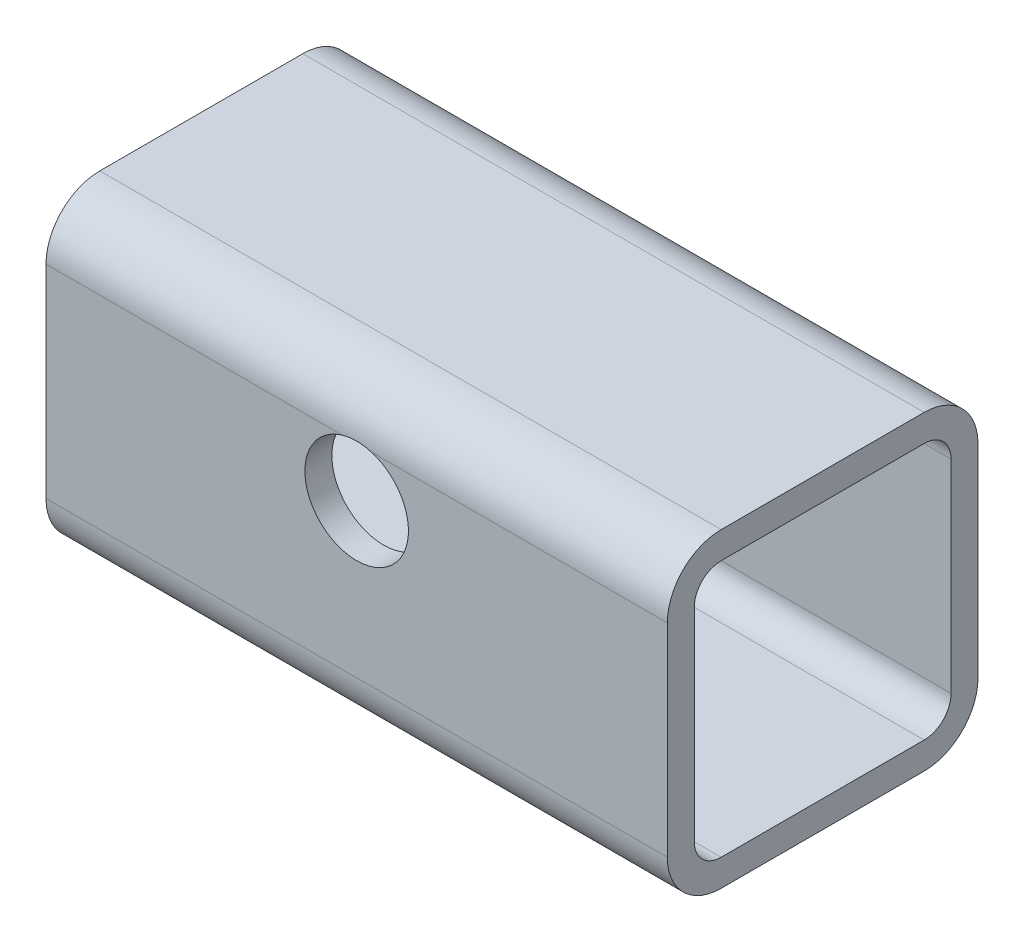
ISO-10303-21;
HEADER;
FILE_DESCRIPTION(('STEP AP214'),'2;1');
FILE_NAME('part.step','',(''),(''),'','','');
FILE_SCHEMA(('AUTOMOTIVE_DESIGN { 1 0 10303 214 1 1 1 1 }'));
ENDSEC;
DATA;
#1=APPLICATION_CONTEXT('core data for automotive mechanical design processes');
#2=APPLICATION_PROTOCOL_DEFINITION('international standard','automotive_design',2000,#1);
#3=PRODUCT_CONTEXT('',#1,'mechanical');
#4=PRODUCT('Part','Part','',(#3));
#5=PRODUCT_RELATED_PRODUCT_CATEGORY('part','',(#4));
#6=PRODUCT_DEFINITION_FORMATION('','',#4);
#7=PRODUCT_DEFINITION_CONTEXT('part definition',#1,'design');
#8=PRODUCT_DEFINITION('design','',#6,#7);
#9=PRODUCT_DEFINITION_SHAPE('','',#8);
#10=(LENGTH_UNIT() NAMED_UNIT(*) SI_UNIT(.MILLI.,.METRE.));
#11=(NAMED_UNIT(*) PLANE_ANGLE_UNIT() SI_UNIT($,.RADIAN.));
#12=(NAMED_UNIT(*) SI_UNIT($,.STERADIAN.) SOLID_ANGLE_UNIT());
#13=UNCERTAINTY_MEASURE_WITH_UNIT(LENGTH_MEASURE(1.E-05),#10,'distance_accuracy_value','');
#14=(GEOMETRIC_REPRESENTATION_CONTEXT(3) GLOBAL_UNCERTAINTY_ASSIGNED_CONTEXT((#13)) GLOBAL_UNIT_ASSIGNED_CONTEXT((#10,
#11,#12)) REPRESENTATION_CONTEXT('',''));
#15=CARTESIAN_POINT('',(0.,0.,0.));
#16=DIRECTION('',(0.,0.,1.));
#17=DIRECTION('',(1.,0.,0.));
#18=AXIS2_PLACEMENT_3D('',#15,#16,#17);
#19=CARTESIAN_POINT('',(60.,9.8,-9.8));
#20=DIRECTION('',(-1.,0.,0.));
#21=DIRECTION('',(0.,0.,1.));
#22=AXIS2_PLACEMENT_3D('',#19,#20,#21);
#23=CYLINDRICAL_SURFACE('',#22,5.2);
#24=DIRECTION('',(-1.,0.,0.));
#25=VECTOR('',#24,1.);
#26=CARTESIAN_POINT('',(60.,9.8,-15.));
#27=LINE('',#26,#25);
#28=CARTESIAN_POINT('',(60.,9.8,-15.));
#29=VERTEX_POINT('',#28);
#30=CARTESIAN_POINT('',(31.4,9.8,-15.));
#31=VERTEX_POINT('',#30);
#32=EDGE_CURVE('E221',#29,#31,#27,.T.);
#33=ORIENTED_EDGE('',*,*,#32,.T.);
#34=CARTESIAN_POINT('',(31.4,9.8,-15.));
#35=CARTESIAN_POINT('',(31.343155784959,9.81658156900364,-14.9999989720538));
#36=CARTESIAN_POINT('',(31.286021326728,9.83217072184021,-14.9999206417086));
#37=CARTESIAN_POINT('',(31.1714574071763,9.86126958309429,-14.9996595849438));
#38=CARTESIAN_POINT('',(31.1140298994615,9.87478698863816,-14.9994772574498));
#39=CARTESIAN_POINT('',(30.9988797943995,9.8997424563217,-14.999058191233));
#40=CARTESIAN_POINT('',(30.9411583397528,9.91118579016137,-14.9988215940214));
#41=CARTESIAN_POINT('',(30.8254214126575,9.93199648240796,-14.9983348625246));
#42=CARTESIAN_POINT('',(30.767406431461,9.94136657295405,-14.9980847466022));
#43=CARTESIAN_POINT('',(30.6510830015136,9.95803381823512,-14.9976047161396));
#44=CARTESIAN_POINT('',(30.5927745710078,9.96533110026478,-14.9973748003595));
#45=CARTESIAN_POINT('',(30.4758647152712,9.97785607418654,-14.9969612805748));
#46=CARTESIAN_POINT('',(30.417263021649,9.98308126165222,-14.9967777327092));
#47=CARTESIAN_POINT('',(30.2997668530483,9.99146529931364,-14.9964756017275));
#48=CARTESIAN_POINT('',(30.2408720124452,9.99461902658301,-14.9963571797911));
#49=CARTESIAN_POINT('',(30.1227897461331,9.99886309022252,-14.9961964921282));
#50=CARTESIAN_POINT('',(30.0636020449673,9.99994573669491,-14.9961545102505));
#51=CARTESIAN_POINT('',(29.944852214256,10.0000506969647,-14.9961504724372));
#52=CARTESIAN_POINT('',(29.8852900727852,9.99905999991858,-14.9961889212272));
#53=CARTESIAN_POINT('',(29.7664607754381,9.99497347815472,-14.9963438604463));
#54=CARTESIAN_POINT('',(29.7071933492617,9.9918855378676,-14.9964600585584));
#55=CARTESIAN_POINT('',(29.5889538289225,9.98360661333948,-14.996759156126));
#56=CARTESIAN_POINT('',(29.5299813668472,9.9784208831061,-14.9969418888292));
#57=CARTESIAN_POINT('',(29.4123318114976,9.96594846677554,-14.9973550932175));
#58=CARTESIAN_POINT('',(29.3536544457772,9.95866434976154,-14.9975855064303));
#59=CARTESIAN_POINT('',(29.2365949809501,9.94199711915557,-14.9980675601698));
#60=CARTESIAN_POINT('',(29.1782129003298,9.93261387577145,-14.9983192020086));
#61=CARTESIAN_POINT('',(29.0617436033638,9.91175062117661,-14.9988095358786));
#62=CARTESIAN_POINT('',(29.0036568887756,9.90026780884889,-14.9990482100506));
#63=CARTESIAN_POINT('',(28.8877780887966,9.87520716701831,-14.9994713258104));
#64=CARTESIAN_POINT('',(28.8299871725611,9.86162393250286,-14.9996556238099));
#65=CARTESIAN_POINT('',(28.7146982157603,9.83236730610074,-14.9999196380707));
#66=CARTESIAN_POINT('',(28.6572021761365,9.81668602342062,-14.9999989465565));
#67=CARTESIAN_POINT('',(28.6,9.8,-15.));
#68=B_SPLINE_CURVE_WITH_KNOTS('',3,(#34,#35,#36,#37,#38,#39,#40,#41,#42,#43,#44,#45,#46,#47,#48,
#49,#50,#51,#52,#53,#54,#55,#56,#57,#58,#59,#60,#61,#62,#63,#64,#65,#66,#67),.UNSPECIFIED.,.F.,
.F.,(4,2,2,2,2,2,2,2,2,2,2,2,2,2,2,2,4),(0.,0.17763186849784,0.354586892821934,
0.531085639875974,0.707350391326897,0.883604315721001,1.06007062393831,1.2369717238554,
1.41452839012144,1.5932026169863,1.77120882251428,1.94877193689588,2.12611857561294,
2.30347618297122,2.48107215983795,2.65913299220167,2.83788339713572),.UNSPECIFIED.);
#69=CARTESIAN_POINT('',(28.6,9.8,-15.));
#70=VERTEX_POINT('',#69);
#71=EDGE_CURVE('E210',#31,#70,#68,.T.);
#72=ORIENTED_EDGE('',*,*,#71,.T.);
#73=CARTESIAN_POINT('',(0.,9.8,-15.));
#74=VERTEX_POINT('',#73);
#75=EDGE_CURVE('E72',#70,#74,#27,.T.);
#76=ORIENTED_EDGE('',*,*,#75,.T.);
#77=CARTESIAN_POINT('',(0.,9.8,-9.8));
#78=DIRECTION('',(1.,0.,0.));
#79=DIRECTION('',(0.,0.,-1.));
#80=AXIS2_PLACEMENT_3D('',#77,#78,#79);
#81=CIRCLE('',#80,5.2);
#82=CARTESIAN_POINT('',(0.,15.,-9.8));
#83=VERTEX_POINT('',#82);
#84=EDGE_CURVE('E446',#74,#83,#81,.T.);
#85=ORIENTED_EDGE('',*,*,#84,.T.);
#86=DIRECTION('',(-1.,0.,0.));
#87=VECTOR('',#86,1.);
#88=CARTESIAN_POINT('',(60.,15.,-9.8));
#89=LINE('',#88,#87);
#90=CARTESIAN_POINT('',(60.,15.,-9.8));
#91=VERTEX_POINT('',#90);
#92=EDGE_CURVE('E79',#91,#83,#89,.T.);
#93=ORIENTED_EDGE('',*,*,#92,.F.);
#94=CARTESIAN_POINT('',(60.,9.8,-9.8));
#95=DIRECTION('',(1.,0.,0.));
#96=DIRECTION('',(0.,0.,-1.));
#97=AXIS2_PLACEMENT_3D('',#94,#95,#96);
#98=CIRCLE('',#97,5.2);
#99=EDGE_CURVE('E389',#29,#91,#98,.T.);
#100=ORIENTED_EDGE('',*,*,#99,.F.);
#101=EDGE_LOOP('',(#33,#72,#76,#85,#93,#100));
#102=FACE_BOUND('',#101,.T.);
#103=ADVANCED_FACE('F67',(#102),#23,.T.);
#104=CARTESIAN_POINT('',(60.,15.,-9.8));
#105=DIRECTION('',(0.,-1.,0.));
#106=DIRECTION('',(0.,0.,-1.));
#107=AXIS2_PLACEMENT_3D('',#104,#105,#106);
#108=PLANE('',#107);
#109=DIRECTION('',(0.,0.,1.));
#110=VECTOR('',#109,1.);
#111=CARTESIAN_POINT('',(0.,15.,-9.8));
#112=LINE('',#111,#110);
#113=CARTESIAN_POINT('',(0.,15.,9.8));
#114=VERTEX_POINT('',#113);
#115=EDGE_CURVE('E329',#83,#114,#112,.T.);
#116=ORIENTED_EDGE('',*,*,#115,.T.);
#117=DIRECTION('',(-1.,0.,0.));
#118=VECTOR('',#117,1.);
#119=CARTESIAN_POINT('',(60.,15.,9.8));
#120=LINE('',#119,#118);
#121=CARTESIAN_POINT('',(60.,15.,9.8));
#122=VERTEX_POINT('',#121);
#123=EDGE_CURVE('E308',#122,#114,#120,.T.);
#124=ORIENTED_EDGE('',*,*,#123,.F.);
#125=DIRECTION('',(0.,0.,1.));
#126=VECTOR('',#125,1.);
#127=CARTESIAN_POINT('',(60.,15.,-9.8));
#128=LINE('',#127,#126);
#129=EDGE_CURVE('E393',#91,#122,#128,.T.);
#130=ORIENTED_EDGE('',*,*,#129,.F.);
#131=ORIENTED_EDGE('',*,*,#92,.T.);
#132=EDGE_LOOP('',(#116,#124,#130,#131));
#133=FACE_BOUND('',#132,.T.);
#134=ADVANCED_FACE('F269',(#133),#108,.F.);
#135=CARTESIAN_POINT('',(60.,9.8,9.8));
#136=DIRECTION('',(-1.,0.,0.));
#137=DIRECTION('',(0.,0.,1.));
#138=AXIS2_PLACEMENT_3D('',#135,#136,#137);
#139=CYLINDRICAL_SURFACE('',#138,5.2);
#140=DIRECTION('',(-1.,0.,0.));
#141=VECTOR('',#140,1.);
#142=CARTESIAN_POINT('',(60.,9.8,15.));
#143=LINE('',#142,#141);
#144=CARTESIAN_POINT('',(28.6,9.8,15.));
#145=VERTEX_POINT('',#144);
#146=CARTESIAN_POINT('',(0.,9.8,15.));
#147=VERTEX_POINT('',#146);
#148=EDGE_CURVE('E256',#145,#147,#143,.T.);
#149=ORIENTED_EDGE('',*,*,#148,.F.);
#150=CARTESIAN_POINT('',(31.4,9.8,15.));
#151=CARTESIAN_POINT('',(31.3491529439053,9.81483111826522,14.9999681171442));
#152=CARTESIAN_POINT('',(31.2980659313895,9.82885426510369,14.9998816291476));
#153=CARTESIAN_POINT('',(31.1702236160274,9.86177129020494,14.9995773230793));
#154=CARTESIAN_POINT('',(31.0932091518936,9.87966586781765,14.999315820023));
#155=CARTESIAN_POINT('',(30.9675489848587,9.90573953980025,14.9988648614268));
#156=CARTESIAN_POINT('',(30.919132569777,9.91504078543099,14.9986853197788));
#157=CARTESIAN_POINT('',(30.8156265798665,9.93334248611603,14.9982838171331));
#158=CARTESIAN_POINT('',(30.7605010185025,9.94214060260012,14.9980593861503));
#159=CARTESIAN_POINT('',(30.6451607598279,9.95857344700013,14.9975924905294));
#160=CARTESIAN_POINT('',(30.5849219431464,9.96603953767956,14.9973501621667));
#161=CARTESIAN_POINT('',(30.4726214262681,9.97788691407513,14.996937353483));
#162=CARTESIAN_POINT('',(30.42058932418,9.98255301021599,14.9967615671056));
#163=CARTESIAN_POINT('',(30.2895981127596,9.99223294378039,14.9963343411834));
#164=CARTESIAN_POINT('',(30.2105570463711,9.99619077203564,14.9960905048359));
#165=CARTESIAN_POINT('',(30.0861879869144,9.99946247042069,14.995996280124));
#166=CARTESIAN_POINT('',(30.0408879409496,10.0000381300058,14.9960222824834));
#167=CARTESIAN_POINT('',(29.9170033897098,9.9999285301096,14.9963783790303));
#168=CARTESIAN_POINT('',(29.8384162838065,9.99800618914163,14.9969178478119));
#169=CARTESIAN_POINT('',(29.6814228876373,9.99045943770584,14.9977383972759));
#170=CARTESIAN_POINT('',(29.6030165966295,9.98483504245588,14.9980194790204));
#171=CARTESIAN_POINT('',(29.4465555025581,9.96989683767829,14.9985605180255));
#172=CARTESIAN_POINT('',(29.3685006983395,9.96058304028342,14.9988204753555));
#173=CARTESIAN_POINT('',(29.2129170260502,9.93828681073101,14.9992557729465));
#174=CARTESIAN_POINT('',(29.1353881566828,9.92530438762181,14.9994311134161));
#175=CARTESIAN_POINT('',(28.9810285464381,9.89569932705631,14.9997138858353));
#176=CARTESIAN_POINT('',(28.9041978044131,9.87907669558545,14.9998213178964));
#177=CARTESIAN_POINT('',(28.7514048774857,9.84222986345656,14.9999649319156));
#178=CARTESIAN_POINT('',(28.6754426918693,9.82200566575936,15.0000011139323));
#179=CARTESIAN_POINT('',(28.6,9.8,15.));
#180=B_SPLINE_CURVE_WITH_KNOTS('',3,(#150,#151,#152,#153,#154,#155,#156,#157,#158,#159,#160,
#161,#162,#163,#164,#165,#166,#167,#168,#169,#170,#171,#172,#173,#174,#175,#176,#177,#178,#179),
.UNSPECIFIED.,.F.,.F.,(4,2,2,2,2,2,2,2,2,2,2,2,2,2,4),(0.,0.158900873713682,0.396002356912597,
0.543889968775195,0.711329269925982,0.89338728842252,1.0500895569875,1.28740664797233,
1.42330547136926,1.65904608749389,1.89478573457621,2.13052460642471,2.36626289684981,
2.60200079966336,2.83773850867815),.UNSPECIFIED.);
#181=CARTESIAN_POINT('',(31.4,9.8,15.));
#182=VERTEX_POINT('',#181);
#183=EDGE_CURVE('E86',#182,#145,#180,.T.);
#184=ORIENTED_EDGE('',*,*,#183,.F.);
#185=CARTESIAN_POINT('',(60.,9.8,15.));
#186=VERTEX_POINT('',#185);
#187=EDGE_CURVE('E311',#186,#182,#143,.T.);
#188=ORIENTED_EDGE('',*,*,#187,.F.);
#189=CARTESIAN_POINT('',(60.,9.8,9.8));
#190=DIRECTION('',(1.,0.,0.));
#191=DIRECTION('',(0.,0.,-1.));
#192=AXIS2_PLACEMENT_3D('',#189,#190,#191);
#193=CIRCLE('',#192,5.2);
#194=EDGE_CURVE('E396',#122,#186,#193,.T.);
#195=ORIENTED_EDGE('',*,*,#194,.F.);
#196=ORIENTED_EDGE('',*,*,#123,.T.);
#197=CARTESIAN_POINT('',(0.,9.8,9.8));
#198=DIRECTION('',(1.,0.,0.));
#199=DIRECTION('',(0.,0.,-1.));
#200=AXIS2_PLACEMENT_3D('',#197,#198,#199);
#201=CIRCLE('',#200,5.2);
#202=EDGE_CURVE('E324',#114,#147,#201,.T.);
#203=ORIENTED_EDGE('',*,*,#202,.T.);
#204=EDGE_LOOP('',(#149,#184,#188,#195,#196,#203));
#205=FACE_BOUND('',#204,.T.);
#206=ADVANCED_FACE('F258',(#205),#139,.T.);
#207=CARTESIAN_POINT('',(60.,-9.8,15.));
#208=DIRECTION('',(0.,0.,-1.));
#209=DIRECTION('',(-1.,0.,0.));
#210=AXIS2_PLACEMENT_3D('',#207,#208,#209);
#211=PLANE('',#210);
#212=ORIENTED_EDGE('',*,*,#187,.T.);
#213=CARTESIAN_POINT('',(30.,5.,15.));
#214=DIRECTION('',(0.,0.,1.));
#215=DIRECTION('',(1.,0.,0.));
#216=AXIS2_PLACEMENT_3D('',#213,#214,#215);
#217=CIRCLE('',#216,5.);
#218=EDGE_CURVE('E322',#145,#182,#217,.T.);
#219=ORIENTED_EDGE('',*,*,#218,.F.);
#220=ORIENTED_EDGE('',*,*,#148,.T.);
#221=DIRECTION('',(0.,-1.,0.));
#222=VECTOR('',#221,1.);
#223=CARTESIAN_POINT('',(0.,-9.8,15.));
#224=LINE('',#223,#222);
#225=CARTESIAN_POINT('',(0.,-9.8,15.));
#226=VERTEX_POINT('',#225);
#227=EDGE_CURVE('E321',#147,#226,#224,.T.);
#228=ORIENTED_EDGE('',*,*,#227,.T.);
#229=DIRECTION('',(-1.,0.,0.));
#230=VECTOR('',#229,1.);
#231=CARTESIAN_POINT('',(60.,-9.8,15.));
#232=LINE('',#231,#230);
#233=CARTESIAN_POINT('',(60.,-9.8,15.));
#234=VERTEX_POINT('',#233);
#235=EDGE_CURVE('E303',#234,#226,#232,.T.);
#236=ORIENTED_EDGE('',*,*,#235,.F.);
#237=DIRECTION('',(0.,-1.,0.));
#238=VECTOR('',#237,1.);
#239=CARTESIAN_POINT('',(60.,-9.8,15.));
#240=LINE('',#239,#238);
#241=EDGE_CURVE('E399',#186,#234,#240,.T.);
#242=ORIENTED_EDGE('',*,*,#241,.F.);
#243=EDGE_LOOP('',(#212,#219,#220,#228,#236,#242));
#244=FACE_BOUND('',#243,.T.);
#245=ADVANCED_FACE('F268',(#244),#211,.F.);
#246=CARTESIAN_POINT('',(60.,-9.8,9.8));
#247=DIRECTION('',(-1.,0.,0.));
#248=DIRECTION('',(0.,0.,1.));
#249=AXIS2_PLACEMENT_3D('',#246,#247,#248);
#250=CYLINDRICAL_SURFACE('',#249,5.2);
#251=CARTESIAN_POINT('',(0.,-9.8,9.8));
#252=DIRECTION('',(1.,0.,0.));
#253=DIRECTION('',(0.,0.,-1.));
#254=AXIS2_PLACEMENT_3D('',#251,#252,#253);
#255=CIRCLE('',#254,5.2);
#256=CARTESIAN_POINT('',(0.,-15.,9.8));
#257=VERTEX_POINT('',#256);
#258=EDGE_CURVE('E334',#226,#257,#255,.T.);
#259=ORIENTED_EDGE('',*,*,#258,.T.);
#260=DIRECTION('',(-1.,0.,0.));
#261=VECTOR('',#260,1.);
#262=CARTESIAN_POINT('',(60.,-15.,9.8));
#263=LINE('',#262,#261);
#264=CARTESIAN_POINT('',(60.,-15.,9.8));
#265=VERTEX_POINT('',#264);
#266=EDGE_CURVE('E299',#265,#257,#263,.T.);
#267=ORIENTED_EDGE('',*,*,#266,.F.);
#268=CARTESIAN_POINT('',(60.,-9.8,9.8));
#269=DIRECTION('',(1.,0.,0.));
#270=DIRECTION('',(0.,0.,-1.));
#271=AXIS2_PLACEMENT_3D('',#268,#269,#270);
#272=CIRCLE('',#271,5.2);
#273=EDGE_CURVE('E402',#234,#265,#272,.T.);
#274=ORIENTED_EDGE('',*,*,#273,.F.);
#275=ORIENTED_EDGE('',*,*,#235,.T.);
#276=EDGE_LOOP('',(#259,#267,#274,#275));
#277=FACE_BOUND('',#276,.T.);
#278=ADVANCED_FACE('F552',(#277),#250,.T.);
#279=CARTESIAN_POINT('',(60.,-15.,9.8));
#280=DIRECTION('',(0.,1.,0.));
#281=DIRECTION('',(0.,0.,1.));
#282=AXIS2_PLACEMENT_3D('',#279,#280,#281);
#283=PLANE('',#282);
#284=DIRECTION('',(0.,0.,-1.));
#285=VECTOR('',#284,1.);
#286=CARTESIAN_POINT('',(0.,-15.,9.8));
#287=LINE('',#286,#285);
#288=CARTESIAN_POINT('',(0.,-15.,-9.8));
#289=VERTEX_POINT('',#288);
#290=EDGE_CURVE('E338',#257,#289,#287,.T.);
#291=ORIENTED_EDGE('',*,*,#290,.T.);
#292=DIRECTION('',(-1.,0.,0.));
#293=VECTOR('',#292,1.);
#294=CARTESIAN_POINT('',(60.,-15.,-9.8));
#295=LINE('',#294,#293);
#296=CARTESIAN_POINT('',(60.,-15.,-9.8));
#297=VERTEX_POINT('',#296);
#298=EDGE_CURVE('E295',#297,#289,#295,.T.);
#299=ORIENTED_EDGE('',*,*,#298,.F.);
#300=DIRECTION('',(0.,0.,-1.));
#301=VECTOR('',#300,1.);
#302=CARTESIAN_POINT('',(60.,-15.,9.8));
#303=LINE('',#302,#301);
#304=EDGE_CURVE('E405',#265,#297,#303,.T.);
#305=ORIENTED_EDGE('',*,*,#304,.F.);
#306=ORIENTED_EDGE('',*,*,#266,.T.);
#307=EDGE_LOOP('',(#291,#299,#305,#306));
#308=FACE_BOUND('',#307,.T.);
#309=ADVANCED_FACE('F547',(#308),#283,.F.);
#310=CARTESIAN_POINT('',(60.,-9.8,-9.8));
#311=DIRECTION('',(-1.,0.,0.));
#312=DIRECTION('',(0.,0.,1.));
#313=AXIS2_PLACEMENT_3D('',#310,#311,#312);
#314=CYLINDRICAL_SURFACE('',#313,5.2);
#315=CARTESIAN_POINT('',(0.,-9.8,-9.8));
#316=DIRECTION('',(1.,0.,0.));
#317=DIRECTION('',(0.,0.,-1.));
#318=AXIS2_PLACEMENT_3D('',#315,#316,#317);
#319=CIRCLE('',#318,5.2);
#320=CARTESIAN_POINT('',(0.,-9.8,-15.));
#321=VERTEX_POINT('',#320);
#322=EDGE_CURVE('E343',#289,#321,#319,.T.);
#323=ORIENTED_EDGE('',*,*,#322,.T.);
#324=DIRECTION('',(-1.,0.,0.));
#325=VECTOR('',#324,1.);
#326=CARTESIAN_POINT('',(60.,-9.8,-15.));
#327=LINE('',#326,#325);
#328=CARTESIAN_POINT('',(60.,-9.8,-15.));
#329=VERTEX_POINT('',#328);
#330=EDGE_CURVE('E235',#329,#321,#327,.T.);
#331=ORIENTED_EDGE('',*,*,#330,.F.);
#332=CARTESIAN_POINT('',(60.,-9.8,-9.8));
#333=DIRECTION('',(1.,0.,0.));
#334=DIRECTION('',(0.,0.,-1.));
#335=AXIS2_PLACEMENT_3D('',#332,#333,#334);
#336=CIRCLE('',#335,5.2);
#337=EDGE_CURVE('E408',#297,#329,#336,.T.);
#338=ORIENTED_EDGE('',*,*,#337,.F.);
#339=ORIENTED_EDGE('',*,*,#298,.T.);
#340=EDGE_LOOP('',(#323,#331,#338,#339));
#341=FACE_BOUND('',#340,.T.);
#342=ADVANCED_FACE('F542',(#341),#314,.T.);
#343=CARTESIAN_POINT('',(60.,9.8,9.8));
#344=DIRECTION('',(-1.,0.,0.));
#345=DIRECTION('',(0.,0.,1.));
#346=AXIS2_PLACEMENT_3D('',#343,#344,#345);
#347=CYLINDRICAL_SURFACE('',#346,2.6);
#348=CARTESIAN_POINT('',(28.6,9.8,12.4));
#349=CARTESIAN_POINT('',(28.6682218028846,9.81989801218617,12.3999963920888));
#350=CARTESIAN_POINT('',(28.7368586872689,9.83833872609492,12.3997720826648));
#351=CARTESIAN_POINT('',(28.8748536764175,9.87227825565255,12.3990512345332));
#352=CARTESIAN_POINT('',(28.94421177114,9.88777711220434,12.3985546996109));
#353=CARTESIAN_POINT('',(29.153203818833,9.92982000850826,12.3969105248649));
#354=CARTESIAN_POINT('',(29.2937589814304,9.95191137956892,12.3956082978441));
#355=CARTESIAN_POINT('',(29.5729353294105,9.98366253841054,12.393552550057));
#356=CARTESIAN_POINT('',(29.7115251990587,9.99360016520899,12.3927869438548));
#357=CARTESIAN_POINT('',(29.9889953313389,10.001914430985,12.392149721752));
#358=CARTESIAN_POINT('',(30.1278754907364,10.00029464967,12.3922778290388));
#359=CARTESIAN_POINT('',(30.4566972047728,9.98273704661954,12.3935990279105));
#360=CARTESIAN_POINT('',(30.6463990808293,9.96169312354255,12.3951708571664));
#361=CARTESIAN_POINT('',(30.9296452115551,9.9137719603034,12.397555537091));
#362=CARTESIAN_POINT('',(31.0246115505461,9.89484914502915,12.3983616050628));
#363=CARTESIAN_POINT('',(31.2133055625079,9.8515207942107,12.3995779711224));
#364=CARTESIAN_POINT('',(31.3070330082341,9.82711426719503,12.3999881975698));
#365=CARTESIAN_POINT('',(31.4,9.8,12.4));
#366=B_SPLINE_CURVE_WITH_KNOTS('',3,(#348,#349,#350,#351,#352,#353,#354,#355,#356,#357,#358,
#359,#360,#361,#362,#363,#364,#365),.UNSPECIFIED.,.F.,.F.,(4,2,2,2,2,2,2,2,4),(0.,
0.213158048087103,0.426313132255314,0.852612567278013,1.26897263338285,1.68520374474833,
2.25639796525296,2.5467700750208,2.83719472724097),.UNSPECIFIED.);
#367=CARTESIAN_POINT('',(28.6,9.8,12.4));
#368=VERTEX_POINT('',#367);
#369=CARTESIAN_POINT('',(31.4,9.8,12.4));
#370=VERTEX_POINT('',#369);
#371=EDGE_CURVE('E496',#368,#370,#366,.T.);
#372=ORIENTED_EDGE('',*,*,#371,.F.);
#373=DIRECTION('',(-1.,0.,0.));
#374=VECTOR('',#373,1.);
#375=CARTESIAN_POINT('',(60.,9.8,12.4));
#376=LINE('',#375,#374);
#377=CARTESIAN_POINT('',(0.,9.8,12.4));
#378=VERTEX_POINT('',#377);
#379=EDGE_CURVE('E414',#368,#378,#376,.T.);
#380=ORIENTED_EDGE('',*,*,#379,.T.);
#381=CARTESIAN_POINT('',(0.,9.8,9.8));
#382=DIRECTION('',(1.,0.,0.));
#383=DIRECTION('',(0.,0.,-1.));
#384=AXIS2_PLACEMENT_3D('',#381,#382,#383);
#385=CIRCLE('',#384,2.6);
#386=CARTESIAN_POINT('',(0.,12.4,9.8));
#387=VERTEX_POINT('',#386);
#388=EDGE_CURVE('E223',#387,#378,#385,.T.);
#389=ORIENTED_EDGE('',*,*,#388,.F.);
#390=DIRECTION('',(-1.,0.,0.));
#391=VECTOR('',#390,1.);
#392=CARTESIAN_POINT('',(60.,12.4,9.8));
#393=LINE('',#392,#391);
#394=CARTESIAN_POINT('',(60.,12.4,9.8));
#395=VERTEX_POINT('',#394);
#396=EDGE_CURVE('E232',#395,#387,#393,.T.);
#397=ORIENTED_EDGE('',*,*,#396,.F.);
#398=CARTESIAN_POINT('',(60.,9.8,9.8));
#399=DIRECTION('',(1.,0.,0.));
#400=DIRECTION('',(0.,0.,-1.));
#401=AXIS2_PLACEMENT_3D('',#398,#399,#400);
#402=CIRCLE('',#401,2.6);
#403=CARTESIAN_POINT('',(60.,9.8,12.4));
#404=VERTEX_POINT('',#403);
#405=EDGE_CURVE('E349',#395,#404,#402,.T.);
#406=ORIENTED_EDGE('',*,*,#405,.T.);
#407=EDGE_CURVE('E453',#404,#370,#376,.T.);
#408=ORIENTED_EDGE('',*,*,#407,.T.);
#409=EDGE_LOOP('',(#372,#380,#389,#397,#406,#408));
#410=FACE_BOUND('',#409,.T.);
#411=ADVANCED_FACE('F69',(#410),#347,.F.);
#412=CARTESIAN_POINT('',(60.,12.4,-9.8));
#413=DIRECTION('',(0.,-1.,0.));
#414=DIRECTION('',(0.,0.,-1.));
#415=AXIS2_PLACEMENT_3D('',#412,#413,#414);
#416=PLANE('',#415);
#417=DIRECTION('',(0.,0.,1.));
#418=VECTOR('',#417,1.);
#419=CARTESIAN_POINT('',(0.,12.4,-9.8));
#420=LINE('',#419,#418);
#421=CARTESIAN_POINT('',(0.,12.4,-9.8));
#422=VERTEX_POINT('',#421);
#423=EDGE_CURVE('E418',#422,#387,#420,.T.);
#424=ORIENTED_EDGE('',*,*,#423,.F.);
#425=DIRECTION('',(-1.,0.,0.));
#426=VECTOR('',#425,1.);
#427=CARTESIAN_POINT('',(60.,12.4,-9.8));
#428=LINE('',#427,#426);
#429=CARTESIAN_POINT('',(60.,12.4,-9.8));
#430=VERTEX_POINT('',#429);
#431=EDGE_CURVE('E236',#430,#422,#428,.T.);
#432=ORIENTED_EDGE('',*,*,#431,.F.);
#433=DIRECTION('',(0.,0.,1.));
#434=VECTOR('',#433,1.);
#435=CARTESIAN_POINT('',(60.,12.4,-9.8));
#436=LINE('',#435,#434);
#437=EDGE_CURVE('E352',#430,#395,#436,.T.);
#438=ORIENTED_EDGE('',*,*,#437,.T.);
#439=ORIENTED_EDGE('',*,*,#396,.T.);
#440=EDGE_LOOP('',(#424,#432,#438,#439));
#441=FACE_BOUND('',#440,.T.);
#442=ADVANCED_FACE('F541',(#441),#416,.T.);
#443=CARTESIAN_POINT('',(60.,9.8,-9.8));
#444=DIRECTION('',(-1.,0.,0.));
#445=DIRECTION('',(0.,0.,1.));
#446=AXIS2_PLACEMENT_3D('',#443,#444,#445);
#447=CYLINDRICAL_SURFACE('',#446,2.6);
#448=CARTESIAN_POINT('',(31.4,9.8,-12.4));
#449=CARTESIAN_POINT('',(31.3317781971154,9.81989801218617,-12.3999963920888));
#450=CARTESIAN_POINT('',(31.2631413127311,9.83833872609492,-12.3997720826648));
#451=CARTESIAN_POINT('',(31.1251463235825,9.87227825565255,-12.3990512345332));
#452=CARTESIAN_POINT('',(31.05578822886,9.88777711220434,-12.3985546996109));
#453=CARTESIAN_POINT('',(30.846796181167,9.92982000850826,-12.3969105248649));
#454=CARTESIAN_POINT('',(30.7062410185696,9.95191137956892,-12.3956082978441));
#455=CARTESIAN_POINT('',(30.4270646705895,9.98366253841054,-12.393552550057));
#456=CARTESIAN_POINT('',(30.2884748009413,9.99360016520899,-12.3927869438548));
#457=CARTESIAN_POINT('',(30.0110046686611,10.001914430985,-12.392149721752));
#458=CARTESIAN_POINT('',(29.8721245092636,10.00029464967,-12.3922778290388));
#459=CARTESIAN_POINT('',(29.5433027952272,9.98273704661954,-12.3935990279105));
#460=CARTESIAN_POINT('',(29.3536009191707,9.96169312354255,-12.3951708571664));
#461=CARTESIAN_POINT('',(29.0703547884449,9.9137719603034,-12.397555537091));
#462=CARTESIAN_POINT('',(28.9753884494539,9.89484914502915,-12.3983616050628));
#463=CARTESIAN_POINT('',(28.7866944374921,9.8515207942107,-12.3995779711224));
#464=CARTESIAN_POINT('',(28.6929669917659,9.82711426719503,-12.3999881975698));
#465=CARTESIAN_POINT('',(28.6,9.8,-12.4));
#466=B_SPLINE_CURVE_WITH_KNOTS('',3,(#448,#449,#450,#451,#452,#453,#454,#455,#456,#457,#458,
#459,#460,#461,#462,#463,#464,#465),.UNSPECIFIED.,.F.,.F.,(4,2,2,2,2,2,2,2,4),(0.,
0.213158048087103,0.426313132255314,0.852612567278013,1.26897263338285,1.68520374474833,
2.25639796525296,2.5467700750208,2.83719472724097),.UNSPECIFIED.);
#467=CARTESIAN_POINT('',(31.4,9.8,-12.4));
#468=VERTEX_POINT('',#467);
#469=CARTESIAN_POINT('',(28.6,9.8,-12.4));
#470=VERTEX_POINT('',#469);
#471=EDGE_CURVE('E94',#468,#470,#466,.T.);
#472=ORIENTED_EDGE('',*,*,#471,.F.);
#473=DIRECTION('',(-1.,0.,0.));
#474=VECTOR('',#473,1.);
#475=CARTESIAN_POINT('',(60.,9.8,-12.4));
#476=LINE('',#475,#474);
#477=CARTESIAN_POINT('',(60.,9.8,-12.4));
#478=VERTEX_POINT('',#477);
#479=EDGE_CURVE('E243',#478,#468,#476,.T.);
#480=ORIENTED_EDGE('',*,*,#479,.F.);
#481=CARTESIAN_POINT('',(60.,9.8,-9.8));
#482=DIRECTION('',(1.,0.,0.));
#483=DIRECTION('',(0.,0.,-1.));
#484=AXIS2_PLACEMENT_3D('',#481,#482,#483);
#485=CIRCLE('',#484,2.6);
#486=EDGE_CURVE('E359',#478,#430,#485,.T.);
#487=ORIENTED_EDGE('',*,*,#486,.T.);
#488=ORIENTED_EDGE('',*,*,#431,.T.);
#489=CARTESIAN_POINT('',(0.,9.8,-9.8));
#490=DIRECTION('',(1.,0.,0.));
#491=DIRECTION('',(0.,0.,-1.));
#492=AXIS2_PLACEMENT_3D('',#489,#490,#491);
#493=CIRCLE('',#492,2.6);
#494=CARTESIAN_POINT('',(0.,9.8,-12.4));
#495=VERTEX_POINT('',#494);
#496=EDGE_CURVE('E422',#495,#422,#493,.T.);
#497=ORIENTED_EDGE('',*,*,#496,.F.);
#498=EDGE_CURVE('E467',#470,#495,#476,.T.);
#499=ORIENTED_EDGE('',*,*,#498,.F.);
#500=EDGE_LOOP('',(#472,#480,#487,#488,#497,#499));
#501=FACE_BOUND('',#500,.T.);
#502=ADVANCED_FACE('F478',(#501),#447,.F.);
#503=CARTESIAN_POINT('',(60.,9.8,-12.4));
#504=DIRECTION('',(0.,0.,1.));
#505=DIRECTION('',(1.,0.,0.));
#506=AXIS2_PLACEMENT_3D('',#503,#504,#505);
#507=PLANE('',#506);
#508=CARTESIAN_POINT('',(30.,5.,-12.4));
#509=DIRECTION('',(0.,0.,1.));
#510=DIRECTION('',(1.,0.,0.));
#511=AXIS2_PLACEMENT_3D('',#508,#509,#510);
#512=CIRCLE('',#511,5.);
#513=EDGE_CURVE('E476',#470,#468,#512,.T.);
#514=ORIENTED_EDGE('',*,*,#513,.F.);
#515=ORIENTED_EDGE('',*,*,#498,.T.);
#516=DIRECTION('',(0.,1.,0.));
#517=VECTOR('',#516,1.);
#518=CARTESIAN_POINT('',(0.,9.8,-12.4));
#519=LINE('',#518,#517);
#520=CARTESIAN_POINT('',(0.,-9.8,-12.4));
#521=VERTEX_POINT('',#520);
#522=EDGE_CURVE('E426',#521,#495,#519,.T.);
#523=ORIENTED_EDGE('',*,*,#522,.F.);
#524=DIRECTION('',(-1.,0.,0.));
#525=VECTOR('',#524,1.);
#526=CARTESIAN_POINT('',(60.,-9.8,-12.4));
#527=LINE('',#526,#525);
#528=CARTESIAN_POINT('',(60.,-9.8,-12.4));
#529=VERTEX_POINT('',#528);
#530=EDGE_CURVE('E465',#529,#521,#527,.T.);
#531=ORIENTED_EDGE('',*,*,#530,.F.);
#532=DIRECTION('',(0.,1.,0.));
#533=VECTOR('',#532,1.);
#534=CARTESIAN_POINT('',(60.,9.8,-12.4));
#535=LINE('',#534,#533);
#536=EDGE_CURVE('E369',#529,#478,#535,.T.);
#537=ORIENTED_EDGE('',*,*,#536,.T.);
#538=ORIENTED_EDGE('',*,*,#479,.T.);
#539=EDGE_LOOP('',(#514,#515,#523,#531,#537,#538));
#540=FACE_BOUND('',#539,.T.);
#541=ADVANCED_FACE('F475',(#540),#507,.T.);
#542=CARTESIAN_POINT('',(60.,-9.8,-9.8));
#543=DIRECTION('',(-1.,0.,0.));
#544=DIRECTION('',(0.,0.,1.));
#545=AXIS2_PLACEMENT_3D('',#542,#543,#544);
#546=CYLINDRICAL_SURFACE('',#545,2.6);
#547=CARTESIAN_POINT('',(0.,-9.8,-9.8));
#548=DIRECTION('',(1.,0.,0.));
#549=DIRECTION('',(0.,0.,-1.));
#550=AXIS2_PLACEMENT_3D('',#547,#548,#549);
#551=CIRCLE('',#550,2.6);
#552=CARTESIAN_POINT('',(0.,-12.4,-9.8));
#553=VERTEX_POINT('',#552);
#554=EDGE_CURVE('E430',#553,#521,#551,.T.);
#555=ORIENTED_EDGE('',*,*,#554,.F.);
#556=DIRECTION('',(-1.,0.,0.));
#557=VECTOR('',#556,1.);
#558=CARTESIAN_POINT('',(60.,-12.4,-9.8));
#559=LINE('',#558,#557);
#560=CARTESIAN_POINT('',(60.,-12.4,-9.8));
#561=VERTEX_POINT('',#560);
#562=EDGE_CURVE('E462',#561,#553,#559,.T.);
#563=ORIENTED_EDGE('',*,*,#562,.F.);
#564=CARTESIAN_POINT('',(60.,-9.8,-9.8));
#565=DIRECTION('',(1.,0.,0.));
#566=DIRECTION('',(0.,0.,-1.));
#567=AXIS2_PLACEMENT_3D('',#564,#565,#566);
#568=CIRCLE('',#567,2.6);
#569=EDGE_CURVE('E373',#561,#529,#568,.T.);
#570=ORIENTED_EDGE('',*,*,#569,.T.);
#571=ORIENTED_EDGE('',*,*,#530,.T.);
#572=EDGE_LOOP('',(#555,#563,#570,#571));
#573=FACE_BOUND('',#572,.T.);
#574=ADVANCED_FACE('F483',(#573),#546,.F.);
#575=CARTESIAN_POINT('',(60.,-12.4,9.8));
#576=DIRECTION('',(0.,1.,0.));
#577=DIRECTION('',(0.,0.,1.));
#578=AXIS2_PLACEMENT_3D('',#575,#576,#577);
#579=PLANE('',#578);
#580=DIRECTION('',(0.,0.,-1.));
#581=VECTOR('',#580,1.);
#582=CARTESIAN_POINT('',(0.,-12.4,9.8));
#583=LINE('',#582,#581);
#584=CARTESIAN_POINT('',(0.,-12.4,9.8));
#585=VERTEX_POINT('',#584);
#586=EDGE_CURVE('E434',#585,#553,#583,.T.);
#587=ORIENTED_EDGE('',*,*,#586,.F.);
#588=DIRECTION('',(-1.,0.,0.));
#589=VECTOR('',#588,1.);
#590=CARTESIAN_POINT('',(60.,-12.4,9.8));
#591=LINE('',#590,#589);
#592=CARTESIAN_POINT('',(60.,-12.4,9.8));
#593=VERTEX_POINT('',#592);
#594=EDGE_CURVE('E459',#593,#585,#591,.T.);
#595=ORIENTED_EDGE('',*,*,#594,.F.);
#596=DIRECTION('',(0.,0.,-1.));
#597=VECTOR('',#596,1.);
#598=CARTESIAN_POINT('',(60.,-12.4,9.8));
#599=LINE('',#598,#597);
#600=EDGE_CURVE('E377',#593,#561,#599,.T.);
#601=ORIENTED_EDGE('',*,*,#600,.T.);
#602=ORIENTED_EDGE('',*,*,#562,.T.);
#603=EDGE_LOOP('',(#587,#595,#601,#602));
#604=FACE_BOUND('',#603,.T.);
#605=ADVANCED_FACE('F579',(#604),#579,.T.);
#606=CARTESIAN_POINT('',(60.,-9.8,9.8));
#607=DIRECTION('',(-1.,0.,0.));
#608=DIRECTION('',(0.,0.,1.));
#609=AXIS2_PLACEMENT_3D('',#606,#607,#608);
#610=CYLINDRICAL_SURFACE('',#609,2.6);
#611=CARTESIAN_POINT('',(0.,-9.8,9.8));
#612=DIRECTION('',(1.,0.,0.));
#613=DIRECTION('',(0.,0.,-1.));
#614=AXIS2_PLACEMENT_3D('',#611,#612,#613);
#615=CIRCLE('',#614,2.6);
#616=CARTESIAN_POINT('',(0.,-9.8,12.4));
#617=VERTEX_POINT('',#616);
#618=EDGE_CURVE('E438',#617,#585,#615,.T.);
#619=ORIENTED_EDGE('',*,*,#618,.F.);
#620=DIRECTION('',(-1.,0.,0.));
#621=VECTOR('',#620,1.);
#622=CARTESIAN_POINT('',(60.,-9.8,12.4));
#623=LINE('',#622,#621);
#624=CARTESIAN_POINT('',(60.,-9.8,12.4));
#625=VERTEX_POINT('',#624);
#626=EDGE_CURVE('E456',#625,#617,#623,.T.);
#627=ORIENTED_EDGE('',*,*,#626,.F.);
#628=CARTESIAN_POINT('',(60.,-9.8,9.8));
#629=DIRECTION('',(1.,0.,0.));
#630=DIRECTION('',(0.,0.,-1.));
#631=AXIS2_PLACEMENT_3D('',#628,#629,#630);
#632=CIRCLE('',#631,2.6);
#633=EDGE_CURVE('E381',#625,#593,#632,.T.);
#634=ORIENTED_EDGE('',*,*,#633,.T.);
#635=ORIENTED_EDGE('',*,*,#594,.T.);
#636=EDGE_LOOP('',(#619,#627,#634,#635));
#637=FACE_BOUND('',#636,.T.);
#638=ADVANCED_FACE('F575',(#637),#610,.F.);
#639=CARTESIAN_POINT('',(60.,-9.8,12.4));
#640=DIRECTION('',(0.,0.,-1.));
#641=DIRECTION('',(-1.,0.,0.));
#642=AXIS2_PLACEMENT_3D('',#639,#640,#641);
#643=PLANE('',#642);
#644=CARTESIAN_POINT('',(30.,5.,12.4));
#645=DIRECTION('',(0.,0.,-1.));
#646=DIRECTION('',(-1.,0.,0.));
#647=AXIS2_PLACEMENT_3D('',#644,#645,#646);
#648=CIRCLE('',#647,5.);
#649=EDGE_CURVE('E530',#370,#368,#648,.T.);
#650=ORIENTED_EDGE('',*,*,#649,.F.);
#651=ORIENTED_EDGE('',*,*,#407,.F.);
#652=DIRECTION('',(0.,-1.,0.));
#653=VECTOR('',#652,1.);
#654=CARTESIAN_POINT('',(60.,-9.8,12.4));
#655=LINE('',#654,#653);
#656=EDGE_CURVE('E385',#404,#625,#655,.T.);
#657=ORIENTED_EDGE('',*,*,#656,.T.);
#658=ORIENTED_EDGE('',*,*,#626,.T.);
#659=DIRECTION('',(0.,-1.,0.));
#660=VECTOR('',#659,1.);
#661=CARTESIAN_POINT('',(0.,-9.8,12.4));
#662=LINE('',#661,#660);
#663=EDGE_CURVE('E442',#378,#617,#662,.T.);
#664=ORIENTED_EDGE('',*,*,#663,.F.);
#665=ORIENTED_EDGE('',*,*,#379,.F.);
#666=EDGE_LOOP('',(#650,#651,#657,#658,#664,#665));
#667=FACE_BOUND('',#666,.T.);
#668=ADVANCED_FACE('F277',(#667),#643,.T.);
#669=CARTESIAN_POINT('',(60.,9.8,-15.));
#670=DIRECTION('',(0.,0.,1.));
#671=DIRECTION('',(1.,0.,0.));
#672=AXIS2_PLACEMENT_3D('',#669,#670,#671);
#673=PLANE('',#672);
#674=ORIENTED_EDGE('',*,*,#75,.F.);
#675=CARTESIAN_POINT('',(30.,5.,-15.));
#676=DIRECTION('',(0.,0.,1.));
#677=DIRECTION('',(1.,0.,0.));
#678=AXIS2_PLACEMENT_3D('',#675,#676,#677);
#679=CIRCLE('',#678,5.);
#680=EDGE_CURVE('E12',#70,#31,#679,.T.);
#681=ORIENTED_EDGE('',*,*,#680,.T.);
#682=ORIENTED_EDGE('',*,*,#32,.F.);
#683=DIRECTION('',(0.,1.,0.));
#684=VECTOR('',#683,1.);
#685=CARTESIAN_POINT('',(60.,9.8,-15.));
#686=LINE('',#685,#684);
#687=EDGE_CURVE('E411',#329,#29,#686,.T.);
#688=ORIENTED_EDGE('',*,*,#687,.F.);
#689=ORIENTED_EDGE('',*,*,#330,.T.);
#690=DIRECTION('',(0.,1.,0.));
#691=VECTOR('',#690,1.);
#692=CARTESIAN_POINT('',(0.,9.8,-15.));
#693=LINE('',#692,#691);
#694=EDGE_CURVE('E229',#321,#74,#693,.T.);
#695=ORIENTED_EDGE('',*,*,#694,.T.);
#696=EDGE_LOOP('',(#674,#681,#682,#688,#689,#695));
#697=FACE_BOUND('',#696,.T.);
#698=ADVANCED_FACE('F226',(#697),#673,.F.);
#699=CARTESIAN_POINT('',(60.,9.8,-9.8));
#700=DIRECTION('',(1.,0.,0.));
#701=DIRECTION('',(0.,0.,-1.));
#702=AXIS2_PLACEMENT_3D('',#699,#700,#701);
#703=PLANE('',#702);
#704=ORIENTED_EDGE('',*,*,#405,.F.);
#705=ORIENTED_EDGE('',*,*,#437,.F.);
#706=ORIENTED_EDGE('',*,*,#486,.F.);
#707=ORIENTED_EDGE('',*,*,#536,.F.);
#708=ORIENTED_EDGE('',*,*,#569,.F.);
#709=ORIENTED_EDGE('',*,*,#600,.F.);
#710=ORIENTED_EDGE('',*,*,#633,.F.);
#711=ORIENTED_EDGE('',*,*,#656,.F.);
#712=EDGE_LOOP('',(#704,#705,#706,#707,#708,#709,#710,#711));
#713=FACE_BOUND('',#712,.T.);
#714=ORIENTED_EDGE('',*,*,#99,.T.);
#715=ORIENTED_EDGE('',*,*,#129,.T.);
#716=ORIENTED_EDGE('',*,*,#194,.T.);
#717=ORIENTED_EDGE('',*,*,#241,.T.);
#718=ORIENTED_EDGE('',*,*,#273,.T.);
#719=ORIENTED_EDGE('',*,*,#304,.T.);
#720=ORIENTED_EDGE('',*,*,#337,.T.);
#721=ORIENTED_EDGE('',*,*,#687,.T.);
#722=EDGE_LOOP('',(#714,#715,#716,#717,#718,#719,#720,#721));
#723=FACE_BOUND('',#722,.T.);
#724=ADVANCED_FACE('F488',(#713,#723),#703,.T.);
#725=CARTESIAN_POINT('',(0.,9.8,-9.8));
#726=DIRECTION('',(1.,0.,0.));
#727=DIRECTION('',(0.,0.,-1.));
#728=AXIS2_PLACEMENT_3D('',#725,#726,#727);
#729=PLANE('',#728);
#730=ORIENTED_EDGE('',*,*,#388,.T.);
#731=ORIENTED_EDGE('',*,*,#663,.T.);
#732=ORIENTED_EDGE('',*,*,#618,.T.);
#733=ORIENTED_EDGE('',*,*,#586,.T.);
#734=ORIENTED_EDGE('',*,*,#554,.T.);
#735=ORIENTED_EDGE('',*,*,#522,.T.);
#736=ORIENTED_EDGE('',*,*,#496,.T.);
#737=ORIENTED_EDGE('',*,*,#423,.T.);
#738=EDGE_LOOP('',(#730,#731,#732,#733,#734,#735,#736,#737));
#739=FACE_BOUND('',#738,.T.);
#740=ORIENTED_EDGE('',*,*,#84,.F.);
#741=ORIENTED_EDGE('',*,*,#694,.F.);
#742=ORIENTED_EDGE('',*,*,#322,.F.);
#743=ORIENTED_EDGE('',*,*,#290,.F.);
#744=ORIENTED_EDGE('',*,*,#258,.F.);
#745=ORIENTED_EDGE('',*,*,#227,.F.);
#746=ORIENTED_EDGE('',*,*,#202,.F.);
#747=ORIENTED_EDGE('',*,*,#115,.F.);
#748=EDGE_LOOP('',(#740,#741,#742,#743,#744,#745,#746,#747));
#749=FACE_BOUND('',#748,.T.);
#750=ADVANCED_FACE('F332',(#739,#749),#729,.F.);
#751=CARTESIAN_POINT('',(30.,5.,-15.));
#752=DIRECTION('',(0.,0.,1.));
#753=DIRECTION('',(1.,0.,0.));
#754=AXIS2_PLACEMENT_3D('',#751,#752,#753);
#755=CYLINDRICAL_SURFACE('',#754,5.);
#756=ORIENTED_EDGE('',*,*,#471,.T.);
#757=ORIENTED_EDGE('',*,*,#513,.T.);
#758=EDGE_LOOP('',(#756,#757));
#759=FACE_BOUND('',#758,.T.);
#760=ORIENTED_EDGE('',*,*,#680,.F.);
#761=ORIENTED_EDGE('',*,*,#71,.F.);
#762=EDGE_LOOP('',(#760,#761));
#763=FACE_BOUND('',#762,.T.);
#764=ADVANCED_FACE('F209',(#759,#763),#755,.F.);
#765=ORIENTED_EDGE('',*,*,#371,.T.);
#766=ORIENTED_EDGE('',*,*,#649,.T.);
#767=EDGE_LOOP('',(#765,#766));
#768=FACE_BOUND('',#767,.T.);
#769=ORIENTED_EDGE('',*,*,#218,.T.);
#770=ORIENTED_EDGE('',*,*,#183,.T.);
#771=EDGE_LOOP('',(#769,#770));
#772=FACE_BOUND('',#771,.T.);
#773=ADVANCED_FACE('F510',(#768,#772),#755,.F.);
#774=CLOSED_SHELL('',(#103,#134,#206,#245,#278,#309,#342,#411,#442,#502,#541,#574,#605,#638,
#668,#698,#724,#750,#764,#773));
#775=MANIFOLD_SOLID_BREP('B2',#774);
#776=ADVANCED_BREP_SHAPE_REPRESENTATION('',(#18,#775),#14);
#777=SHAPE_DEFINITION_REPRESENTATION(#9,#776);
ENDSEC;
END-ISO-10303-21;
